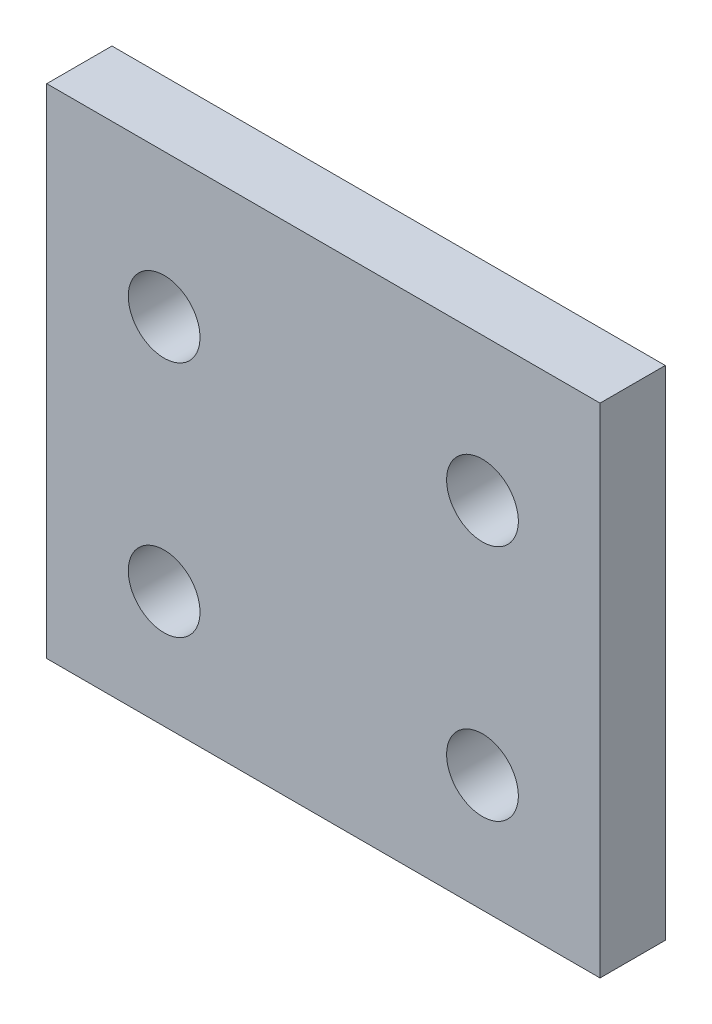
ISO-10303-21;
HEADER;
FILE_DESCRIPTION(('STEP AP214'),'2;1');
FILE_NAME('part.step','',(''),(''),'','','');
FILE_SCHEMA(('AUTOMOTIVE_DESIGN { 1 0 10303 214 1 1 1 1 }'));
ENDSEC;
DATA;
#1=APPLICATION_CONTEXT('core data for automotive mechanical design processes');
#2=APPLICATION_PROTOCOL_DEFINITION('international standard','automotive_design',2000,#1);
#3=PRODUCT_CONTEXT('',#1,'mechanical');
#4=PRODUCT('Part','Part','',(#3));
#5=PRODUCT_RELATED_PRODUCT_CATEGORY('part','',(#4));
#6=PRODUCT_DEFINITION_FORMATION('','',#4);
#7=PRODUCT_DEFINITION_CONTEXT('part definition',#1,'design');
#8=PRODUCT_DEFINITION('design','',#6,#7);
#9=PRODUCT_DEFINITION_SHAPE('','',#8);
#10=(LENGTH_UNIT() NAMED_UNIT(*) SI_UNIT(.MILLI.,.METRE.));
#11=(NAMED_UNIT(*) PLANE_ANGLE_UNIT() SI_UNIT($,.RADIAN.));
#12=(NAMED_UNIT(*) SI_UNIT($,.STERADIAN.) SOLID_ANGLE_UNIT());
#13=UNCERTAINTY_MEASURE_WITH_UNIT(LENGTH_MEASURE(1.E-05),#10,'distance_accuracy_value','');
#14=(GEOMETRIC_REPRESENTATION_CONTEXT(3) GLOBAL_UNCERTAINTY_ASSIGNED_CONTEXT((#13)) GLOBAL_UNIT_ASSIGNED_CONTEXT((#10,
#11,#12)) REPRESENTATION_CONTEXT('',''));
#15=CARTESIAN_POINT('',(0.,0.,0.));
#16=DIRECTION('',(0.,0.,1.));
#17=DIRECTION('',(1.,0.,0.));
#18=AXIS2_PLACEMENT_3D('',#15,#16,#17);
#19=CARTESIAN_POINT('',(0.,0.,2.5));
#20=DIRECTION('',(1.,0.,0.));
#21=DIRECTION('',(0.,0.,-1.));
#22=AXIS2_PLACEMENT_3D('',#19,#20,#21);
#23=PLANE('',#22);
#24=DIRECTION('',(0.,-1.,0.));
#25=VECTOR('',#24,1.);
#26=CARTESIAN_POINT('',(0.,0.,0.));
#27=LINE('',#26,#25);
#28=CARTESIAN_POINT('',(0.,19.08604853,0.));
#29=VERTEX_POINT('',#28);
#30=CARTESIAN_POINT('',(0.,0.,0.));
#31=VERTEX_POINT('',#30);
#32=EDGE_CURVE('E106',#29,#31,#27,.T.);
#33=ORIENTED_EDGE('',*,*,#32,.T.);
#34=DIRECTION('',(0.,0.,-1.));
#35=VECTOR('',#34,1.);
#36=CARTESIAN_POINT('',(0.,0.,2.5));
#37=LINE('',#36,#35);
#38=CARTESIAN_POINT('',(0.,0.,2.5));
#39=VERTEX_POINT('',#38);
#40=EDGE_CURVE('E11',#39,#31,#37,.T.);
#41=ORIENTED_EDGE('',*,*,#40,.F.);
#42=DIRECTION('',(0.,-1.,0.));
#43=VECTOR('',#42,1.);
#44=CARTESIAN_POINT('',(0.,0.,2.5));
#45=LINE('',#44,#43);
#46=CARTESIAN_POINT('',(0.,19.08604853,2.5));
#47=VERTEX_POINT('',#46);
#48=EDGE_CURVE('E90',#47,#39,#45,.T.);
#49=ORIENTED_EDGE('',*,*,#48,.F.);
#50=DIRECTION('',(0.,0.,-1.));
#51=VECTOR('',#50,1.);
#52=CARTESIAN_POINT('',(0.,19.08604853,2.5));
#53=LINE('',#52,#51);
#54=EDGE_CURVE('E102',#47,#29,#53,.T.);
#55=ORIENTED_EDGE('',*,*,#54,.T.);
#56=EDGE_LOOP('',(#33,#41,#49,#55));
#57=FACE_BOUND('',#56,.T.);
#58=ADVANCED_FACE('F38',(#57),#23,.F.);
#59=CARTESIAN_POINT('',(0.,0.,2.5));
#60=DIRECTION('',(0.,1.,0.));
#61=DIRECTION('',(0.,0.,1.));
#62=AXIS2_PLACEMENT_3D('',#59,#60,#61);
#63=PLANE('',#62);
#64=DIRECTION('',(1.,0.,0.));
#65=VECTOR('',#64,1.);
#66=CARTESIAN_POINT('',(0.,0.,0.));
#67=LINE('',#66,#65);
#68=CARTESIAN_POINT('',(21.21128765,0.,0.));
#69=VERTEX_POINT('',#68);
#70=EDGE_CURVE('E95',#31,#69,#67,.T.);
#71=ORIENTED_EDGE('',*,*,#70,.T.);
#72=DIRECTION('',(0.,0.,-1.));
#73=VECTOR('',#72,1.);
#74=CARTESIAN_POINT('',(21.21128765,0.,2.5));
#75=LINE('',#74,#73);
#76=CARTESIAN_POINT('',(21.21128765,0.,2.5));
#77=VERTEX_POINT('',#76);
#78=EDGE_CURVE('E47',#77,#69,#75,.T.);
#79=ORIENTED_EDGE('',*,*,#78,.F.);
#80=DIRECTION('',(1.,0.,0.));
#81=VECTOR('',#80,1.);
#82=CARTESIAN_POINT('',(0.,0.,2.5));
#83=LINE('',#82,#81);
#84=EDGE_CURVE('E85',#39,#77,#83,.T.);
#85=ORIENTED_EDGE('',*,*,#84,.F.);
#86=ORIENTED_EDGE('',*,*,#40,.T.);
#87=EDGE_LOOP('',(#71,#79,#85,#86));
#88=FACE_BOUND('',#87,.T.);
#89=ADVANCED_FACE('F94',(#88),#63,.F.);
#90=CARTESIAN_POINT('',(21.21128765,0.,2.5));
#91=DIRECTION('',(-1.,0.,0.));
#92=DIRECTION('',(0.,0.,1.));
#93=AXIS2_PLACEMENT_3D('',#90,#91,#92);
#94=PLANE('',#93);
#95=DIRECTION('',(0.,1.,0.));
#96=VECTOR('',#95,1.);
#97=CARTESIAN_POINT('',(21.21128765,0.,0.));
#98=LINE('',#97,#96);
#99=CARTESIAN_POINT('',(21.21128765,19.08604853,0.));
#100=VERTEX_POINT('',#99);
#101=EDGE_CURVE('E72',#69,#100,#98,.T.);
#102=ORIENTED_EDGE('',*,*,#101,.T.);
#103=DIRECTION('',(0.,0.,-1.));
#104=VECTOR('',#103,1.);
#105=CARTESIAN_POINT('',(21.21128765,19.08604853,2.5));
#106=LINE('',#105,#104);
#107=CARTESIAN_POINT('',(21.21128765,19.08604853,2.5));
#108=VERTEX_POINT('',#107);
#109=EDGE_CURVE('E97',#108,#100,#106,.T.);
#110=ORIENTED_EDGE('',*,*,#109,.F.);
#111=DIRECTION('',(0.,1.,0.));
#112=VECTOR('',#111,1.);
#113=CARTESIAN_POINT('',(21.21128765,0.,2.5));
#114=LINE('',#113,#112);
#115=EDGE_CURVE('E88',#77,#108,#114,.T.);
#116=ORIENTED_EDGE('',*,*,#115,.F.);
#117=ORIENTED_EDGE('',*,*,#78,.T.);
#118=EDGE_LOOP('',(#102,#110,#116,#117));
#119=FACE_BOUND('',#118,.T.);
#120=ADVANCED_FACE('F98',(#119),#94,.F.);
#121=CARTESIAN_POINT('',(0.,19.08604853,2.5));
#122=DIRECTION('',(0.,-1.,0.));
#123=DIRECTION('',(0.,0.,-1.));
#124=AXIS2_PLACEMENT_3D('',#121,#122,#123);
#125=PLANE('',#124);
#126=DIRECTION('',(-1.,0.,0.));
#127=VECTOR('',#126,1.);
#128=CARTESIAN_POINT('',(0.,19.08604853,0.));
#129=LINE('',#128,#127);
#130=EDGE_CURVE('E78',#100,#29,#129,.T.);
#131=ORIENTED_EDGE('',*,*,#130,.T.);
#132=ORIENTED_EDGE('',*,*,#54,.F.);
#133=DIRECTION('',(-1.,0.,0.));
#134=VECTOR('',#133,1.);
#135=CARTESIAN_POINT('',(0.,19.08604853,2.5));
#136=LINE('',#135,#134);
#137=EDGE_CURVE('E55',#108,#47,#136,.T.);
#138=ORIENTED_EDGE('',*,*,#137,.F.);
#139=ORIENTED_EDGE('',*,*,#109,.T.);
#140=EDGE_LOOP('',(#131,#132,#138,#139));
#141=FACE_BOUND('',#140,.T.);
#142=ADVANCED_FACE('F120',(#141),#125,.F.);
#143=CARTESIAN_POINT('',(0.,0.,2.5));
#144=DIRECTION('',(0.,0.,-1.));
#145=DIRECTION('',(-1.,0.,0.));
#146=AXIS2_PLACEMENT_3D('',#143,#144,#145);
#147=PLANE('',#146);
#148=CARTESIAN_POINT('',(4.50061561,13.5977062,2.5));
#149=DIRECTION('',(0.,0.,-1.));
#150=DIRECTION('',(-1.,0.,0.));
#151=AXIS2_PLACEMENT_3D('',#148,#149,#150);
#152=CIRCLE('',#151,1.375);
#153=CARTESIAN_POINT('',(3.12561561,13.5977062,2.5));
#154=VERTEX_POINT('',#153);
#155=EDGE_CURVE('E131',#154,#154,#152,.T.);
#156=ORIENTED_EDGE('',*,*,#155,.T.);
#157=EDGE_LOOP('',(#156));
#158=FACE_BOUND('',#157,.T.);
#159=CARTESIAN_POINT('',(16.70317329,4.48009656,2.5));
#160=DIRECTION('',(0.,0.,-1.));
#161=DIRECTION('',(-1.,0.,0.));
#162=AXIS2_PLACEMENT_3D('',#159,#160,#161);
#163=CIRCLE('',#162,1.375);
#164=CARTESIAN_POINT('',(15.32817329,4.48009656,2.5));
#165=VERTEX_POINT('',#164);
#166=EDGE_CURVE('E139',#165,#165,#163,.T.);
#167=ORIENTED_EDGE('',*,*,#166,.T.);
#168=EDGE_LOOP('',(#167));
#169=FACE_BOUND('',#168,.T.);
#170=CARTESIAN_POINT('',(4.50061561,4.48009656,2.5));
#171=DIRECTION('',(0.,0.,-1.));
#172=DIRECTION('',(-1.,0.,0.));
#173=AXIS2_PLACEMENT_3D('',#170,#171,#172);
#174=CIRCLE('',#173,1.375);
#175=CARTESIAN_POINT('',(3.12561561,4.48009656,2.5));
#176=VERTEX_POINT('',#175);
#177=EDGE_CURVE('E140',#176,#176,#174,.T.);
#178=ORIENTED_EDGE('',*,*,#177,.T.);
#179=EDGE_LOOP('',(#178));
#180=FACE_BOUND('',#179,.T.);
#181=CARTESIAN_POINT('',(16.70317329,13.5977062,2.5));
#182=DIRECTION('',(0.,0.,-1.));
#183=DIRECTION('',(-1.,0.,0.));
#184=AXIS2_PLACEMENT_3D('',#181,#182,#183);
#185=CIRCLE('',#184,1.375);
#186=CARTESIAN_POINT('',(15.32817329,13.5977062,2.5));
#187=VERTEX_POINT('',#186);
#188=EDGE_CURVE('E110',#187,#187,#185,.T.);
#189=ORIENTED_EDGE('',*,*,#188,.T.);
#190=EDGE_LOOP('',(#189));
#191=FACE_BOUND('',#190,.T.);
#192=ORIENTED_EDGE('',*,*,#48,.T.);
#193=ORIENTED_EDGE('',*,*,#84,.T.);
#194=ORIENTED_EDGE('',*,*,#115,.T.);
#195=ORIENTED_EDGE('',*,*,#137,.T.);
#196=EDGE_LOOP('',(#192,#193,#194,#195));
#197=FACE_BOUND('',#196,.T.);
#198=ADVANCED_FACE('F86',(#158,#169,#180,#191,#197),#147,.F.);
#199=CARTESIAN_POINT('',(0.,0.,0.));
#200=DIRECTION('',(0.,0.,-1.));
#201=DIRECTION('',(-1.,0.,0.));
#202=AXIS2_PLACEMENT_3D('',#199,#200,#201);
#203=PLANE('',#202);
#204=CARTESIAN_POINT('',(4.50061561,13.5977062,0.));
#205=DIRECTION('',(0.,0.,-1.));
#206=DIRECTION('',(-1.,0.,0.));
#207=AXIS2_PLACEMENT_3D('',#204,#205,#206);
#208=CIRCLE('',#207,1.375);
#209=CARTESIAN_POINT('',(3.12561561,13.5977062,0.));
#210=VERTEX_POINT('',#209);
#211=EDGE_CURVE('E144',#210,#210,#208,.T.);
#212=ORIENTED_EDGE('',*,*,#211,.F.);
#213=EDGE_LOOP('',(#212));
#214=FACE_BOUND('',#213,.T.);
#215=CARTESIAN_POINT('',(16.70317329,4.48009656,0.));
#216=DIRECTION('',(0.,0.,-1.));
#217=DIRECTION('',(-1.,0.,0.));
#218=AXIS2_PLACEMENT_3D('',#215,#216,#217);
#219=CIRCLE('',#218,1.375);
#220=CARTESIAN_POINT('',(15.32817329,4.48009656,0.));
#221=VERTEX_POINT('',#220);
#222=EDGE_CURVE('E135',#221,#221,#219,.T.);
#223=ORIENTED_EDGE('',*,*,#222,.F.);
#224=EDGE_LOOP('',(#223));
#225=FACE_BOUND('',#224,.T.);
#226=CARTESIAN_POINT('',(4.50061561,4.48009656,0.));
#227=DIRECTION('',(0.,0.,-1.));
#228=DIRECTION('',(-1.,0.,0.));
#229=AXIS2_PLACEMENT_3D('',#226,#227,#228);
#230=CIRCLE('',#229,1.375);
#231=CARTESIAN_POINT('',(3.12561561,4.48009656,0.));
#232=VERTEX_POINT('',#231);
#233=EDGE_CURVE('E151',#232,#232,#230,.T.);
#234=ORIENTED_EDGE('',*,*,#233,.F.);
#235=EDGE_LOOP('',(#234));
#236=FACE_BOUND('',#235,.T.);
#237=CARTESIAN_POINT('',(16.70317329,13.5977062,0.));
#238=DIRECTION('',(0.,0.,-1.));
#239=DIRECTION('',(-1.,0.,0.));
#240=AXIS2_PLACEMENT_3D('',#237,#238,#239);
#241=CIRCLE('',#240,1.375);
#242=CARTESIAN_POINT('',(15.32817329,13.5977062,0.));
#243=VERTEX_POINT('',#242);
#244=EDGE_CURVE('E127',#243,#243,#241,.T.);
#245=ORIENTED_EDGE('',*,*,#244,.F.);
#246=EDGE_LOOP('',(#245));
#247=FACE_BOUND('',#246,.T.);
#248=ORIENTED_EDGE('',*,*,#32,.F.);
#249=ORIENTED_EDGE('',*,*,#130,.F.);
#250=ORIENTED_EDGE('',*,*,#101,.F.);
#251=ORIENTED_EDGE('',*,*,#70,.F.);
#252=EDGE_LOOP('',(#248,#249,#250,#251));
#253=FACE_BOUND('',#252,.T.);
#254=ADVANCED_FACE('F123',(#214,#225,#236,#247,#253),#203,.T.);
#255=CARTESIAN_POINT('',(16.70317329,13.5977062,2.5));
#256=DIRECTION('',(0.,0.,-1.));
#257=DIRECTION('',(-1.,0.,0.));
#258=AXIS2_PLACEMENT_3D('',#255,#256,#257);
#259=CYLINDRICAL_SURFACE('',#258,1.375);
#260=ORIENTED_EDGE('',*,*,#188,.F.);
#261=EDGE_LOOP('',(#260));
#262=FACE_BOUND('',#261,.T.);
#263=ORIENTED_EDGE('',*,*,#244,.T.);
#264=EDGE_LOOP('',(#263));
#265=FACE_BOUND('',#264,.T.);
#266=ADVANCED_FACE('F165',(#262,#265),#259,.F.);
#267=CARTESIAN_POINT('',(4.50061561,4.48009656,2.5));
#268=DIRECTION('',(0.,0.,-1.));
#269=DIRECTION('',(-1.,0.,0.));
#270=AXIS2_PLACEMENT_3D('',#267,#268,#269);
#271=CYLINDRICAL_SURFACE('',#270,1.375);
#272=ORIENTED_EDGE('',*,*,#177,.F.);
#273=EDGE_LOOP('',(#272));
#274=FACE_BOUND('',#273,.T.);
#275=ORIENTED_EDGE('',*,*,#233,.T.);
#276=EDGE_LOOP('',(#275));
#277=FACE_BOUND('',#276,.T.);
#278=ADVANCED_FACE('F161',(#274,#277),#271,.F.);
#279=CARTESIAN_POINT('',(16.70317329,4.48009656,2.5));
#280=DIRECTION('',(0.,0.,-1.));
#281=DIRECTION('',(-1.,0.,0.));
#282=AXIS2_PLACEMENT_3D('',#279,#280,#281);
#283=CYLINDRICAL_SURFACE('',#282,1.375);
#284=ORIENTED_EDGE('',*,*,#166,.F.);
#285=EDGE_LOOP('',(#284));
#286=FACE_BOUND('',#285,.T.);
#287=ORIENTED_EDGE('',*,*,#222,.T.);
#288=EDGE_LOOP('',(#287));
#289=FACE_BOUND('',#288,.T.);
#290=ADVANCED_FACE('F164',(#286,#289),#283,.F.);
#291=CARTESIAN_POINT('',(4.50061561,13.5977062,2.5));
#292=DIRECTION('',(0.,0.,-1.));
#293=DIRECTION('',(-1.,0.,0.));
#294=AXIS2_PLACEMENT_3D('',#291,#292,#293);
#295=CYLINDRICAL_SURFACE('',#294,1.375);
#296=ORIENTED_EDGE('',*,*,#155,.F.);
#297=EDGE_LOOP('',(#296));
#298=FACE_BOUND('',#297,.T.);
#299=ORIENTED_EDGE('',*,*,#211,.T.);
#300=EDGE_LOOP('',(#299));
#301=FACE_BOUND('',#300,.T.);
#302=ADVANCED_FACE('F205',(#298,#301),#295,.F.);
#303=CLOSED_SHELL('',(#58,#89,#120,#142,#198,#254,#266,#278,#290,#302));
#304=MANIFOLD_SOLID_BREP('B2',#303);
#305=ADVANCED_BREP_SHAPE_REPRESENTATION('',(#18,#304),#14);
#306=SHAPE_DEFINITION_REPRESENTATION(#9,#305);
ENDSEC;
END-ISO-10303-21;
